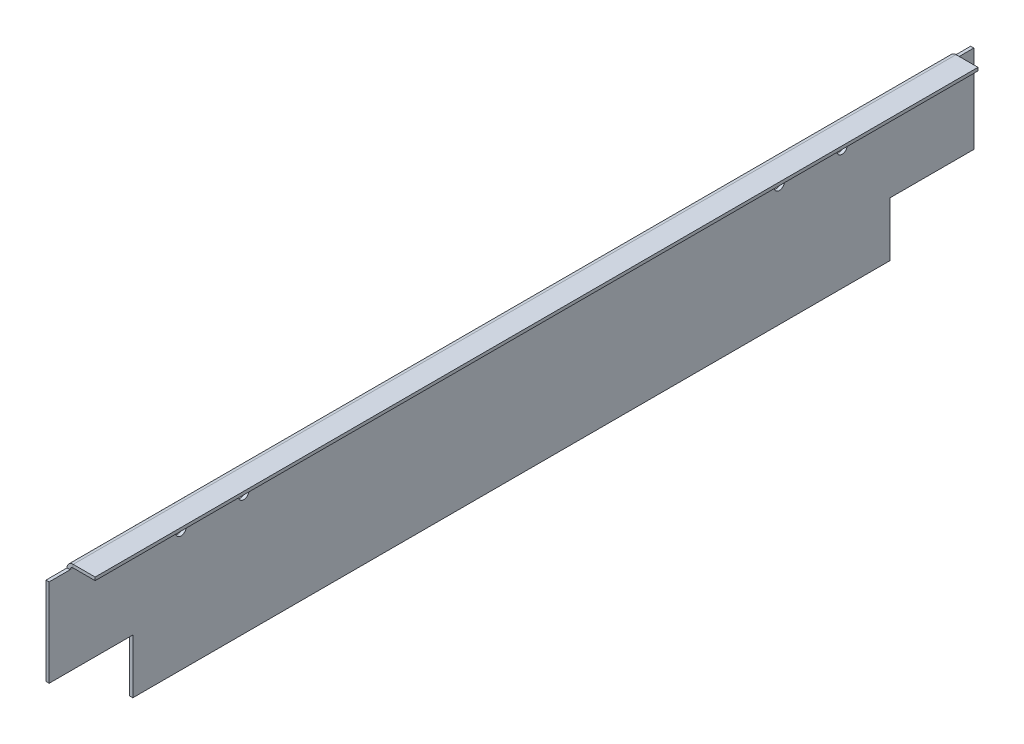
ISO-10303-21;
HEADER;
FILE_DESCRIPTION(('STEP AP214'),'2;1');
FILE_NAME('part.step','',(''),(''),'','','');
FILE_SCHEMA(('AUTOMOTIVE_DESIGN { 1 0 10303 214 1 1 1 1 }'));
ENDSEC;
DATA;
#1=APPLICATION_CONTEXT('core data for automotive mechanical design processes');
#2=APPLICATION_PROTOCOL_DEFINITION('international standard','automotive_design',2000,#1);
#3=PRODUCT_CONTEXT('',#1,'mechanical');
#4=PRODUCT('Part','Part','',(#3));
#5=PRODUCT_RELATED_PRODUCT_CATEGORY('part','',(#4));
#6=PRODUCT_DEFINITION_FORMATION('','',#4);
#7=PRODUCT_DEFINITION_CONTEXT('part definition',#1,'design');
#8=PRODUCT_DEFINITION('design','',#6,#7);
#9=PRODUCT_DEFINITION_SHAPE('','',#8);
#10=(LENGTH_UNIT() NAMED_UNIT(*) SI_UNIT(.MILLI.,.METRE.));
#11=(NAMED_UNIT(*) PLANE_ANGLE_UNIT() SI_UNIT($,.RADIAN.));
#12=(NAMED_UNIT(*) SI_UNIT($,.STERADIAN.) SOLID_ANGLE_UNIT());
#13=UNCERTAINTY_MEASURE_WITH_UNIT(LENGTH_MEASURE(1.E-05),#10,'distance_accuracy_value','');
#14=(GEOMETRIC_REPRESENTATION_CONTEXT(3) GLOBAL_UNCERTAINTY_ASSIGNED_CONTEXT((#13)) GLOBAL_UNIT_ASSIGNED_CONTEXT((#10,
#11,#12)) REPRESENTATION_CONTEXT('',''));
#15=CARTESIAN_POINT('',(0.,0.,0.));
#16=DIRECTION('',(0.,0.,1.));
#17=DIRECTION('',(1.,0.,0.));
#18=AXIS2_PLACEMENT_3D('',#15,#16,#17);
#19=CARTESIAN_POINT('',(-1.5,0.,181.));
#20=DIRECTION('',(0.,1.,0.));
#21=DIRECTION('',(0.,0.,1.));
#22=AXIS2_PLACEMENT_3D('',#19,#20,#21);
#23=PLANE('',#22);
#24=DIRECTION('',(0.,0.,1.));
#25=VECTOR('',#24,1.);
#26=CARTESIAN_POINT('',(0.,0.,181.));
#27=LINE('',#26,#25);
#28=CARTESIAN_POINT('',(0.,0.,211.));
#29=VERTEX_POINT('',#28);
#30=CARTESIAN_POINT('',(0.,0.,221.));
#31=VERTEX_POINT('',#30);
#32=EDGE_CURVE('E310',#29,#31,#27,.T.);
#33=ORIENTED_EDGE('',*,*,#32,.F.);
#34=DIRECTION('',(-1.,0.,0.));
#35=VECTOR('',#34,1.);
#36=CARTESIAN_POINT('',(0.,0.,211.));
#37=LINE('',#36,#35);
#38=CARTESIAN_POINT('',(-1.5,0.,211.));
#39=VERTEX_POINT('',#38);
#40=EDGE_CURVE('E218',#29,#39,#37,.T.);
#41=ORIENTED_EDGE('',*,*,#40,.T.);
#42=DIRECTION('',(0.,0.,1.));
#43=VECTOR('',#42,1.);
#44=CARTESIAN_POINT('',(-1.5,0.,181.));
#45=LINE('',#44,#43);
#46=CARTESIAN_POINT('',(-1.5,0.,221.));
#47=VERTEX_POINT('',#46);
#48=EDGE_CURVE('E299',#39,#47,#45,.T.);
#49=ORIENTED_EDGE('',*,*,#48,.T.);
#50=DIRECTION('',(1.,0.,0.));
#51=VECTOR('',#50,1.);
#52=CARTESIAN_POINT('',(-1.5,0.,221.));
#53=LINE('',#52,#51);
#54=EDGE_CURVE('E253',#47,#31,#53,.T.);
#55=ORIENTED_EDGE('',*,*,#54,.T.);
#56=EDGE_LOOP('',(#33,#41,#49,#55));
#57=FACE_BOUND('',#56,.T.);
#58=ADVANCED_FACE('F65',(#57),#23,.T.);
#59=CARTESIAN_POINT('',(-1.5,0.,-181.));
#60=DIRECTION('',(0.,0.,-1.));
#61=DIRECTION('',(-1.,0.,0.));
#62=AXIS2_PLACEMENT_3D('',#59,#60,#61);
#63=PLANE('',#62);
#64=DIRECTION('',(0.,1.,0.));
#65=VECTOR('',#64,1.);
#66=CARTESIAN_POINT('',(-1.5,0.,-181.));
#67=LINE('',#66,#65);
#68=CARTESIAN_POINT('',(-1.5,-68.,-181.));
#69=VERTEX_POINT('',#68);
#70=CARTESIAN_POINT('',(-1.5,-42.,-181.));
#71=VERTEX_POINT('',#70);
#72=EDGE_CURVE('E296',#69,#71,#67,.T.);
#73=ORIENTED_EDGE('',*,*,#72,.T.);
#74=DIRECTION('',(1.,0.,0.));
#75=VECTOR('',#74,1.);
#76=CARTESIAN_POINT('',(-1.5,-42.,-181.));
#77=LINE('',#76,#75);
#78=CARTESIAN_POINT('',(0.,-42.,-181.));
#79=VERTEX_POINT('',#78);
#80=EDGE_CURVE('E239',#71,#79,#77,.T.);
#81=ORIENTED_EDGE('',*,*,#80,.T.);
#82=DIRECTION('',(0.,1.,0.));
#83=VECTOR('',#82,1.);
#84=CARTESIAN_POINT('',(0.,0.,-181.));
#85=LINE('',#84,#83);
#86=CARTESIAN_POINT('',(0.,-68.,-181.));
#87=VERTEX_POINT('',#86);
#88=EDGE_CURVE('E307',#87,#79,#85,.T.);
#89=ORIENTED_EDGE('',*,*,#88,.F.);
#90=DIRECTION('',(1.,0.,0.));
#91=VECTOR('',#90,1.);
#92=CARTESIAN_POINT('',(-1.5,-68.,-181.));
#93=LINE('',#92,#91);
#94=EDGE_CURVE('E13',#69,#87,#93,.T.);
#95=ORIENTED_EDGE('',*,*,#94,.F.);
#96=EDGE_LOOP('',(#73,#81,#89,#95));
#97=FACE_BOUND('',#96,.T.);
#98=ADVANCED_FACE('F338',(#97),#63,.T.);
#99=CARTESIAN_POINT('',(-1.5,0.,181.));
#100=DIRECTION('',(0.,0.,1.));
#101=DIRECTION('',(1.,0.,0.));
#102=AXIS2_PLACEMENT_3D('',#99,#100,#101);
#103=PLANE('',#102);
#104=DIRECTION('',(1.,0.,0.));
#105=VECTOR('',#104,1.);
#106=CARTESIAN_POINT('',(-1.5,-42.,181.));
#107=LINE('',#106,#105);
#108=CARTESIAN_POINT('',(-1.5,-42.,181.));
#109=VERTEX_POINT('',#108);
#110=CARTESIAN_POINT('',(0.,-42.,181.));
#111=VERTEX_POINT('',#110);
#112=EDGE_CURVE('E258',#109,#111,#107,.T.);
#113=ORIENTED_EDGE('',*,*,#112,.F.);
#114=DIRECTION('',(0.,-1.,0.));
#115=VECTOR('',#114,1.);
#116=CARTESIAN_POINT('',(-1.5,0.,181.));
#117=LINE('',#116,#115);
#118=CARTESIAN_POINT('',(-1.5,-68.,181.));
#119=VERTEX_POINT('',#118);
#120=EDGE_CURVE('E290',#109,#119,#117,.T.);
#121=ORIENTED_EDGE('',*,*,#120,.T.);
#122=DIRECTION('',(1.,0.,0.));
#123=VECTOR('',#122,1.);
#124=CARTESIAN_POINT('',(-1.5,-68.,181.));
#125=LINE('',#124,#123);
#126=CARTESIAN_POINT('',(0.,-68.,181.));
#127=VERTEX_POINT('',#126);
#128=EDGE_CURVE('E69',#119,#127,#125,.T.);
#129=ORIENTED_EDGE('',*,*,#128,.T.);
#130=DIRECTION('',(0.,-1.,0.));
#131=VECTOR('',#130,1.);
#132=CARTESIAN_POINT('',(0.,0.,181.));
#133=LINE('',#132,#131);
#134=EDGE_CURVE('E269',#111,#127,#133,.T.);
#135=ORIENTED_EDGE('',*,*,#134,.F.);
#136=EDGE_LOOP('',(#113,#121,#129,#135));
#137=FACE_BOUND('',#136,.T.);
#138=ADVANCED_FACE('F67',(#137),#103,.T.);
#139=DIRECTION('',(-1.,0.,0.));
#140=VECTOR('',#139,1.);
#141=CARTESIAN_POINT('',(0.,0.,-211.));
#142=LINE('',#141,#140);
#143=CARTESIAN_POINT('',(0.,0.,-211.));
#144=VERTEX_POINT('',#143);
#145=CARTESIAN_POINT('',(-1.49999999999998,0.,-211.));
#146=VERTEX_POINT('',#145);
#147=EDGE_CURVE('E225',#144,#146,#142,.T.);
#148=ORIENTED_EDGE('',*,*,#147,.F.);
#149=CARTESIAN_POINT('',(0.,0.,-221.));
#150=VERTEX_POINT('',#149);
#151=EDGE_CURVE('E293',#150,#144,#27,.T.);
#152=ORIENTED_EDGE('',*,*,#151,.F.);
#153=DIRECTION('',(1.,0.,0.));
#154=VECTOR('',#153,1.);
#155=CARTESIAN_POINT('',(-1.5,0.,-221.));
#156=LINE('',#155,#154);
#157=CARTESIAN_POINT('',(-1.5,0.,-221.));
#158=VERTEX_POINT('',#157);
#159=EDGE_CURVE('E242',#158,#150,#156,.T.);
#160=ORIENTED_EDGE('',*,*,#159,.F.);
#161=EDGE_CURVE('E300',#158,#146,#45,.T.);
#162=ORIENTED_EDGE('',*,*,#161,.T.);
#163=EDGE_LOOP('',(#148,#152,#160,#162));
#164=FACE_BOUND('',#163,.T.);
#165=ADVANCED_FACE('F346',(#164),#23,.T.);
#166=CARTESIAN_POINT('',(-1.5,-68.,181.));
#167=DIRECTION('',(0.,-1.,0.));
#168=DIRECTION('',(0.,0.,-1.));
#169=AXIS2_PLACEMENT_3D('',#166,#167,#168);
#170=PLANE('',#169);
#171=DIRECTION('',(0.,0.,-1.));
#172=VECTOR('',#171,1.);
#173=CARTESIAN_POINT('',(0.,-68.,181.));
#174=LINE('',#173,#172);
#175=EDGE_CURVE('E304',#127,#87,#174,.T.);
#176=ORIENTED_EDGE('',*,*,#175,.F.);
#177=ORIENTED_EDGE('',*,*,#128,.F.);
#178=DIRECTION('',(0.,0.,-1.));
#179=VECTOR('',#178,1.);
#180=CARTESIAN_POINT('',(-1.5,-68.,181.));
#181=LINE('',#180,#179);
#182=EDGE_CURVE('E292',#119,#69,#181,.T.);
#183=ORIENTED_EDGE('',*,*,#182,.T.);
#184=ORIENTED_EDGE('',*,*,#94,.T.);
#185=EDGE_LOOP('',(#176,#177,#183,#184));
#186=FACE_BOUND('',#185,.T.);
#187=ADVANCED_FACE('F334',(#186),#170,.T.);
#188=CARTESIAN_POINT('',(-1.5,0.,0.));
#189=DIRECTION('',(1.,0.,0.));
#190=DIRECTION('',(0.,0.,-1.));
#191=AXIS2_PLACEMENT_3D('',#188,#189,#190);
#192=PLANE('',#191);
#193=CARTESIAN_POINT('',(-1.5,-10.,-158.));
#194=DIRECTION('',(1.,0.,0.));
#195=DIRECTION('',(0.,0.,-1.));
#196=AXIS2_PLACEMENT_3D('',#193,#194,#195);
#197=CIRCLE('',#196,2.5);
#198=CARTESIAN_POINT('',(-1.5,-10.,-160.5));
#199=VERTEX_POINT('',#198);
#200=EDGE_CURVE('E266',#199,#199,#197,.T.);
#201=ORIENTED_EDGE('',*,*,#200,.T.);
#202=EDGE_LOOP('',(#201));
#203=FACE_BOUND('',#202,.T.);
#204=CARTESIAN_POINT('',(-1.5,-10.,-128.));
#205=DIRECTION('',(1.,0.,0.));
#206=DIRECTION('',(0.,0.,-1.));
#207=AXIS2_PLACEMENT_3D('',#204,#205,#206);
#208=CIRCLE('',#207,2.5);
#209=CARTESIAN_POINT('',(-1.5,-10.,-130.5));
#210=VERTEX_POINT('',#209);
#211=EDGE_CURVE('E273',#210,#210,#208,.T.);
#212=ORIENTED_EDGE('',*,*,#211,.T.);
#213=EDGE_LOOP('',(#212));
#214=FACE_BOUND('',#213,.T.);
#215=CARTESIAN_POINT('',(-1.5,-10.,128.));
#216=DIRECTION('',(1.,0.,0.));
#217=DIRECTION('',(0.,0.,1.));
#218=AXIS2_PLACEMENT_3D('',#215,#216,#217);
#219=CIRCLE('',#218,2.5);
#220=CARTESIAN_POINT('',(-1.5,-10.,130.5));
#221=VERTEX_POINT('',#220);
#222=EDGE_CURVE('E279',#221,#221,#219,.T.);
#223=ORIENTED_EDGE('',*,*,#222,.T.);
#224=EDGE_LOOP('',(#223));
#225=FACE_BOUND('',#224,.T.);
#226=CARTESIAN_POINT('',(-1.5,-10.,158.));
#227=DIRECTION('',(1.,0.,0.));
#228=DIRECTION('',(0.,0.,1.));
#229=AXIS2_PLACEMENT_3D('',#226,#227,#228);
#230=CIRCLE('',#229,2.5);
#231=CARTESIAN_POINT('',(-1.5,-10.,160.5));
#232=VERTEX_POINT('',#231);
#233=EDGE_CURVE('E285',#232,#232,#230,.T.);
#234=ORIENTED_EDGE('',*,*,#233,.T.);
#235=EDGE_LOOP('',(#234));
#236=FACE_BOUND('',#235,.T.);
#237=ORIENTED_EDGE('',*,*,#120,.F.);
#238=DIRECTION('',(0.,0.,-1.));
#239=VECTOR('',#238,1.);
#240=CARTESIAN_POINT('',(-1.5,-42.,181.));
#241=LINE('',#240,#239);
#242=CARTESIAN_POINT('',(-1.5,-42.,221.));
#243=VERTEX_POINT('',#242);
#244=EDGE_CURVE('E249',#243,#109,#241,.T.);
#245=ORIENTED_EDGE('',*,*,#244,.F.);
#246=DIRECTION('',(0.,-1.,0.));
#247=VECTOR('',#246,1.);
#248=CARTESIAN_POINT('',(-1.5,-42.,221.));
#249=LINE('',#248,#247);
#250=EDGE_CURVE('E246',#47,#243,#249,.T.);
#251=ORIENTED_EDGE('',*,*,#250,.F.);
#252=ORIENTED_EDGE('',*,*,#48,.F.);
#253=DIRECTION('',(0.,0.,1.));
#254=VECTOR('',#253,1.);
#255=CARTESIAN_POINT('',(-1.50000000000005,0.,211.));
#256=LINE('',#255,#254);
#257=EDGE_CURVE('E169',#39,#146,#256,.F.);
#258=ORIENTED_EDGE('',*,*,#257,.T.);
#259=ORIENTED_EDGE('',*,*,#161,.F.);
#260=DIRECTION('',(0.,1.,0.));
#261=VECTOR('',#260,1.);
#262=CARTESIAN_POINT('',(-1.5,-42.,-221.));
#263=LINE('',#262,#261);
#264=CARTESIAN_POINT('',(-1.5,-42.,-221.));
#265=VERTEX_POINT('',#264);
#266=EDGE_CURVE('E231',#265,#158,#263,.T.);
#267=ORIENTED_EDGE('',*,*,#266,.F.);
#268=DIRECTION('',(0.,0.,-1.));
#269=VECTOR('',#268,1.);
#270=CARTESIAN_POINT('',(-1.5,-42.,-181.));
#271=LINE('',#270,#269);
#272=EDGE_CURVE('E228',#71,#265,#271,.T.);
#273=ORIENTED_EDGE('',*,*,#272,.F.);
#274=ORIENTED_EDGE('',*,*,#72,.F.);
#275=ORIENTED_EDGE('',*,*,#182,.F.);
#276=EDGE_LOOP('',(#237,#245,#251,#252,#258,#259,#267,#273,#274,#275));
#277=FACE_BOUND('',#276,.T.);
#278=ADVANCED_FACE('F351',(#203,#214,#225,#236,#277),#192,.F.);
#279=CARTESIAN_POINT('',(0.,0.,0.));
#280=DIRECTION('',(1.,0.,0.));
#281=DIRECTION('',(0.,0.,-1.));
#282=AXIS2_PLACEMENT_3D('',#279,#280,#281);
#283=PLANE('',#282);
#284=CARTESIAN_POINT('',(0.,-10.,-158.));
#285=DIRECTION('',(1.,0.,0.));
#286=DIRECTION('',(0.,0.,-1.));
#287=AXIS2_PLACEMENT_3D('',#284,#285,#286);
#288=CIRCLE('',#287,2.5);
#289=CARTESIAN_POINT('',(0.,-10.,-160.5));
#290=VERTEX_POINT('',#289);
#291=EDGE_CURVE('E270',#290,#290,#288,.T.);
#292=ORIENTED_EDGE('',*,*,#291,.F.);
#293=EDGE_LOOP('',(#292));
#294=FACE_BOUND('',#293,.T.);
#295=CARTESIAN_POINT('',(0.,-10.,-128.));
#296=DIRECTION('',(1.,0.,0.));
#297=DIRECTION('',(0.,0.,-1.));
#298=AXIS2_PLACEMENT_3D('',#295,#296,#297);
#299=CIRCLE('',#298,2.5);
#300=CARTESIAN_POINT('',(0.,-10.,-130.5));
#301=VERTEX_POINT('',#300);
#302=EDGE_CURVE('E276',#301,#301,#299,.T.);
#303=ORIENTED_EDGE('',*,*,#302,.F.);
#304=EDGE_LOOP('',(#303));
#305=FACE_BOUND('',#304,.T.);
#306=CARTESIAN_POINT('',(0.,-10.,128.));
#307=DIRECTION('',(1.,0.,0.));
#308=DIRECTION('',(0.,0.,1.));
#309=AXIS2_PLACEMENT_3D('',#306,#307,#308);
#310=CIRCLE('',#309,2.5);
#311=CARTESIAN_POINT('',(0.,-10.,130.5));
#312=VERTEX_POINT('',#311);
#313=EDGE_CURVE('E282',#312,#312,#310,.T.);
#314=ORIENTED_EDGE('',*,*,#313,.F.);
#315=EDGE_LOOP('',(#314));
#316=FACE_BOUND('',#315,.T.);
#317=CARTESIAN_POINT('',(0.,-10.,158.));
#318=DIRECTION('',(1.,0.,0.));
#319=DIRECTION('',(0.,0.,1.));
#320=AXIS2_PLACEMENT_3D('',#317,#318,#319);
#321=CIRCLE('',#320,2.5);
#322=CARTESIAN_POINT('',(0.,-10.,160.5));
#323=VERTEX_POINT('',#322);
#324=EDGE_CURVE('E261',#323,#323,#321,.T.);
#325=ORIENTED_EDGE('',*,*,#324,.F.);
#326=EDGE_LOOP('',(#325));
#327=FACE_BOUND('',#326,.T.);
#328=ORIENTED_EDGE('',*,*,#151,.T.);
#329=DIRECTION('',(0.,0.,1.));
#330=VECTOR('',#329,1.);
#331=CARTESIAN_POINT('',(0.,0.,211.));
#332=LINE('',#331,#330);
#333=EDGE_CURVE('E222',#29,#144,#332,.F.);
#334=ORIENTED_EDGE('',*,*,#333,.F.);
#335=ORIENTED_EDGE('',*,*,#32,.T.);
#336=DIRECTION('',(0.,-1.,0.));
#337=VECTOR('',#336,1.);
#338=CARTESIAN_POINT('',(0.,-42.,221.));
#339=LINE('',#338,#337);
#340=CARTESIAN_POINT('',(0.,-42.,221.));
#341=VERTEX_POINT('',#340);
#342=EDGE_CURVE('E241',#31,#341,#339,.T.);
#343=ORIENTED_EDGE('',*,*,#342,.T.);
#344=DIRECTION('',(0.,0.,-1.));
#345=VECTOR('',#344,1.);
#346=CARTESIAN_POINT('',(0.,-42.,181.));
#347=LINE('',#346,#345);
#348=EDGE_CURVE('E250',#341,#111,#347,.T.);
#349=ORIENTED_EDGE('',*,*,#348,.T.);
#350=ORIENTED_EDGE('',*,*,#134,.T.);
#351=ORIENTED_EDGE('',*,*,#175,.T.);
#352=ORIENTED_EDGE('',*,*,#88,.T.);
#353=DIRECTION('',(0.,0.,-1.));
#354=VECTOR('',#353,1.);
#355=CARTESIAN_POINT('',(0.,-42.,-181.));
#356=LINE('',#355,#354);
#357=CARTESIAN_POINT('',(0.,-42.,-221.));
#358=VERTEX_POINT('',#357);
#359=EDGE_CURVE('E88',#79,#358,#356,.T.);
#360=ORIENTED_EDGE('',*,*,#359,.T.);
#361=DIRECTION('',(0.,1.,0.));
#362=VECTOR('',#361,1.);
#363=CARTESIAN_POINT('',(0.,-42.,-221.));
#364=LINE('',#363,#362);
#365=EDGE_CURVE('E232',#358,#150,#364,.T.);
#366=ORIENTED_EDGE('',*,*,#365,.T.);
#367=EDGE_LOOP('',(#328,#334,#335,#343,#349,#350,#351,#352,#360,#366));
#368=FACE_BOUND('',#367,.T.);
#369=ADVANCED_FACE('F315',(#294,#305,#316,#327,#368),#283,.T.);
#370=CARTESIAN_POINT('',(-1.5,-10.,158.));
#371=DIRECTION('',(1.,0.,0.));
#372=DIRECTION('',(0.,0.,-1.));
#373=AXIS2_PLACEMENT_3D('',#370,#371,#372);
#374=CYLINDRICAL_SURFACE('',#373,2.5);
#375=ORIENTED_EDGE('',*,*,#233,.F.);
#376=EDGE_LOOP('',(#375));
#377=FACE_BOUND('',#376,.T.);
#378=ORIENTED_EDGE('',*,*,#324,.T.);
#379=EDGE_LOOP('',(#378));
#380=FACE_BOUND('',#379,.T.);
#381=ADVANCED_FACE('F555',(#377,#380),#374,.F.);
#382=CARTESIAN_POINT('',(-1.5,-10.,128.));
#383=DIRECTION('',(1.,0.,0.));
#384=DIRECTION('',(0.,0.,-1.));
#385=AXIS2_PLACEMENT_3D('',#382,#383,#384);
#386=CYLINDRICAL_SURFACE('',#385,2.5);
#387=ORIENTED_EDGE('',*,*,#222,.F.);
#388=EDGE_LOOP('',(#387));
#389=FACE_BOUND('',#388,.T.);
#390=ORIENTED_EDGE('',*,*,#313,.T.);
#391=EDGE_LOOP('',(#390));
#392=FACE_BOUND('',#391,.T.);
#393=ADVANCED_FACE('F546',(#389,#392),#386,.F.);
#394=CARTESIAN_POINT('',(-1.5,-10.,-128.));
#395=DIRECTION('',(1.,0.,0.));
#396=DIRECTION('',(0.,0.,-1.));
#397=AXIS2_PLACEMENT_3D('',#394,#395,#396);
#398=CYLINDRICAL_SURFACE('',#397,2.5);
#399=ORIENTED_EDGE('',*,*,#211,.F.);
#400=EDGE_LOOP('',(#399));
#401=FACE_BOUND('',#400,.T.);
#402=ORIENTED_EDGE('',*,*,#302,.T.);
#403=EDGE_LOOP('',(#402));
#404=FACE_BOUND('',#403,.T.);
#405=ADVANCED_FACE('F537',(#401,#404),#398,.F.);
#406=CARTESIAN_POINT('',(-1.5,-10.,-158.));
#407=DIRECTION('',(1.,0.,0.));
#408=DIRECTION('',(0.,0.,-1.));
#409=AXIS2_PLACEMENT_3D('',#406,#407,#408);
#410=CYLINDRICAL_SURFACE('',#409,2.5);
#411=ORIENTED_EDGE('',*,*,#200,.F.);
#412=EDGE_LOOP('',(#411));
#413=FACE_BOUND('',#412,.T.);
#414=ORIENTED_EDGE('',*,*,#291,.T.);
#415=EDGE_LOOP('',(#414));
#416=FACE_BOUND('',#415,.T.);
#417=ADVANCED_FACE('F388',(#413,#416),#410,.F.);
#418=CARTESIAN_POINT('',(-1.5,-42.,181.));
#419=DIRECTION('',(0.,-1.,0.));
#420=DIRECTION('',(0.,0.,-1.));
#421=AXIS2_PLACEMENT_3D('',#418,#419,#420);
#422=PLANE('',#421);
#423=ORIENTED_EDGE('',*,*,#348,.F.);
#424=DIRECTION('',(1.,0.,0.));
#425=VECTOR('',#424,1.);
#426=CARTESIAN_POINT('',(-1.5,-42.,221.));
#427=LINE('',#426,#425);
#428=EDGE_CURVE('E262',#243,#341,#427,.T.);
#429=ORIENTED_EDGE('',*,*,#428,.F.);
#430=ORIENTED_EDGE('',*,*,#244,.T.);
#431=ORIENTED_EDGE('',*,*,#112,.T.);
#432=EDGE_LOOP('',(#423,#429,#430,#431));
#433=FACE_BOUND('',#432,.T.);
#434=ADVANCED_FACE('F326',(#433),#422,.T.);
#435=CARTESIAN_POINT('',(-1.5,-42.,221.));
#436=DIRECTION('',(0.,0.,1.));
#437=DIRECTION('',(1.,0.,0.));
#438=AXIS2_PLACEMENT_3D('',#435,#436,#437);
#439=PLANE('',#438);
#440=ORIENTED_EDGE('',*,*,#342,.F.);
#441=ORIENTED_EDGE('',*,*,#54,.F.);
#442=ORIENTED_EDGE('',*,*,#250,.T.);
#443=ORIENTED_EDGE('',*,*,#428,.T.);
#444=EDGE_LOOP('',(#440,#441,#442,#443));
#445=FACE_BOUND('',#444,.T.);
#446=ADVANCED_FACE('F323',(#445),#439,.T.);
#447=CARTESIAN_POINT('',(-1.5,-42.,-181.));
#448=DIRECTION('',(0.,-1.,0.));
#449=DIRECTION('',(0.,0.,-1.));
#450=AXIS2_PLACEMENT_3D('',#447,#448,#449);
#451=PLANE('',#450);
#452=ORIENTED_EDGE('',*,*,#359,.F.);
#453=ORIENTED_EDGE('',*,*,#80,.F.);
#454=ORIENTED_EDGE('',*,*,#272,.T.);
#455=DIRECTION('',(1.,0.,0.));
#456=VECTOR('',#455,1.);
#457=CARTESIAN_POINT('',(-1.5,-42.,-221.));
#458=LINE('',#457,#456);
#459=EDGE_CURVE('E235',#265,#358,#458,.T.);
#460=ORIENTED_EDGE('',*,*,#459,.T.);
#461=EDGE_LOOP('',(#452,#453,#454,#460));
#462=FACE_BOUND('',#461,.T.);
#463=ADVANCED_FACE('F353',(#462),#451,.T.);
#464=CARTESIAN_POINT('',(-1.5,-42.,-221.));
#465=DIRECTION('',(0.,0.,-1.));
#466=DIRECTION('',(-1.,0.,0.));
#467=AXIS2_PLACEMENT_3D('',#464,#465,#466);
#468=PLANE('',#467);
#469=ORIENTED_EDGE('',*,*,#365,.F.);
#470=ORIENTED_EDGE('',*,*,#459,.F.);
#471=ORIENTED_EDGE('',*,*,#266,.T.);
#472=ORIENTED_EDGE('',*,*,#159,.T.);
#473=EDGE_LOOP('',(#469,#470,#471,#472));
#474=FACE_BOUND('',#473,.T.);
#475=ADVANCED_FACE('F341',(#474),#468,.T.);
#476=CARTESIAN_POINT('',(1.50000000000003,0.,-211.));
#477=DIRECTION('',(0.,0.,-1.));
#478=DIRECTION('',(-1.,0.,0.));
#479=AXIS2_PLACEMENT_3D('',#476,#477,#478);
#480=PLANE('',#479);
#481=DIRECTION('',(0.,1.,0.));
#482=VECTOR('',#481,1.);
#483=CARTESIAN_POINT('',(1.50000000000003,3.,-211.));
#484=LINE('',#483,#482);
#485=CARTESIAN_POINT('',(1.50000000000002,1.5,-211.));
#486=VERTEX_POINT('',#485);
#487=CARTESIAN_POINT('',(1.50000000000002,3.,-211.));
#488=VERTEX_POINT('',#487);
#489=EDGE_CURVE('E213',#486,#488,#484,.T.);
#490=ORIENTED_EDGE('',*,*,#489,.F.);
#491=CARTESIAN_POINT('',(1.50000000000003,0.,-211.));
#492=DIRECTION('',(0.,0.,1.));
#493=DIRECTION('',(1.,0.,0.));
#494=AXIS2_PLACEMENT_3D('',#491,#492,#493);
#495=CIRCLE('',#494,1.50000000000002);
#496=EDGE_CURVE('E171',#144,#486,#495,.F.);
#497=ORIENTED_EDGE('',*,*,#496,.F.);
#498=ORIENTED_EDGE('',*,*,#147,.T.);
#499=CARTESIAN_POINT('',(1.50000000000003,0.,-211.));
#500=DIRECTION('',(0.,0.,1.));
#501=DIRECTION('',(1.,0.,0.));
#502=AXIS2_PLACEMENT_3D('',#499,#500,#501);
#503=CIRCLE('',#502,3.00000000000001);
#504=EDGE_CURVE('E217',#146,#488,#503,.F.);
#505=ORIENTED_EDGE('',*,*,#504,.T.);
#506=EDGE_LOOP('',(#490,#497,#498,#505));
#507=FACE_BOUND('',#506,.T.);
#508=ADVANCED_FACE('F349',(#507),#480,.T.);
#509=CARTESIAN_POINT('',(1.49999999999997,0.,211.));
#510=DIRECTION('',(0.,0.,-1.));
#511=DIRECTION('',(-1.,0.,0.));
#512=AXIS2_PLACEMENT_3D('',#509,#510,#511);
#513=PLANE('',#512);
#514=CARTESIAN_POINT('',(1.49999999999997,0.,211.));
#515=DIRECTION('',(0.,0.,1.));
#516=DIRECTION('',(1.,0.,0.));
#517=AXIS2_PLACEMENT_3D('',#514,#515,#516);
#518=CIRCLE('',#517,1.50000000000002);
#519=CARTESIAN_POINT('',(1.49999999999996,1.50000000000003,211.));
#520=VERTEX_POINT('',#519);
#521=EDGE_CURVE('E178',#520,#29,#518,.T.);
#522=ORIENTED_EDGE('',*,*,#521,.F.);
#523=DIRECTION('',(0.,1.,0.));
#524=VECTOR('',#523,1.);
#525=CARTESIAN_POINT('',(1.49999999999996,1.49999999999996,211.));
#526=LINE('',#525,#524);
#527=CARTESIAN_POINT('',(1.49999999999995,3.,211.));
#528=VERTEX_POINT('',#527);
#529=EDGE_CURVE('E175',#520,#528,#526,.T.);
#530=ORIENTED_EDGE('',*,*,#529,.T.);
#531=CARTESIAN_POINT('',(1.49999999999997,0.,211.));
#532=DIRECTION('',(0.,0.,1.));
#533=DIRECTION('',(1.,0.,0.));
#534=AXIS2_PLACEMENT_3D('',#531,#532,#533);
#535=CIRCLE('',#534,3.00000000000001);
#536=EDGE_CURVE('E80',#528,#39,#535,.T.);
#537=ORIENTED_EDGE('',*,*,#536,.T.);
#538=ORIENTED_EDGE('',*,*,#40,.F.);
#539=EDGE_LOOP('',(#522,#530,#537,#538));
#540=FACE_BOUND('',#539,.T.);
#541=ADVANCED_FACE('F176',(#540),#513,.F.);
#542=CARTESIAN_POINT('',(1.49999999999997,0.,211.));
#543=DIRECTION('',(0.,0.,1.));
#544=DIRECTION('',(0.,1.,0.));
#545=AXIS2_PLACEMENT_3D('',#542,#543,#544);
#546=CYLINDRICAL_SURFACE('',#545,3.00000000000001);
#547=ORIENTED_EDGE('',*,*,#257,.F.);
#548=ORIENTED_EDGE('',*,*,#536,.F.);
#549=DIRECTION('',(0.,0.,1.));
#550=VECTOR('',#549,1.);
#551=CARTESIAN_POINT('',(1.49999999999999,3.,0.));
#552=LINE('',#551,#550);
#553=EDGE_CURVE('E166',#488,#528,#552,.T.);
#554=ORIENTED_EDGE('',*,*,#553,.F.);
#555=ORIENTED_EDGE('',*,*,#504,.F.);
#556=EDGE_LOOP('',(#547,#548,#554,#555));
#557=FACE_BOUND('',#556,.T.);
#558=ADVANCED_FACE('F163',(#557),#546,.T.);
#559=CARTESIAN_POINT('',(1.49999999999997,0.,211.));
#560=DIRECTION('',(0.,0.,1.));
#561=DIRECTION('',(0.,1.,0.));
#562=AXIS2_PLACEMENT_3D('',#559,#560,#561);
#563=CYLINDRICAL_SURFACE('',#562,1.50000000000002);
#564=ORIENTED_EDGE('',*,*,#333,.T.);
#565=ORIENTED_EDGE('',*,*,#496,.T.);
#566=DIRECTION('',(0.,0.,-1.));
#567=VECTOR('',#566,1.);
#568=CARTESIAN_POINT('',(1.50000000000003,1.5,-211.));
#569=LINE('',#568,#567);
#570=EDGE_CURVE('E183',#486,#520,#569,.F.);
#571=ORIENTED_EDGE('',*,*,#570,.T.);
#572=ORIENTED_EDGE('',*,*,#521,.T.);
#573=EDGE_LOOP('',(#564,#565,#571,#572));
#574=FACE_BOUND('',#573,.T.);
#575=ADVANCED_FACE('F448',(#574),#563,.F.);
#576=CARTESIAN_POINT('',(0.,2.99999999999999,211.));
#577=DIRECTION('',(0.,0.,1.));
#578=DIRECTION('',(1.,0.,0.));
#579=AXIS2_PLACEMENT_3D('',#576,#577,#578);
#580=PLANE('',#579);
#581=DIRECTION('',(-1.,0.,0.));
#582=VECTOR('',#581,1.);
#583=CARTESIAN_POINT('',(0.,2.99999999999999,211.));
#584=LINE('',#583,#582);
#585=CARTESIAN_POINT('',(12.,3.00000000000004,211.));
#586=VERTEX_POINT('',#585);
#587=EDGE_CURVE('E190',#586,#528,#584,.T.);
#588=ORIENTED_EDGE('',*,*,#587,.T.);
#589=ORIENTED_EDGE('',*,*,#529,.F.);
#590=DIRECTION('',(1.,0.,0.));
#591=VECTOR('',#590,1.);
#592=CARTESIAN_POINT('',(0.,1.49999999999999,211.));
#593=LINE('',#592,#591);
#594=CARTESIAN_POINT('',(12.,1.50000000000004,211.));
#595=VERTEX_POINT('',#594);
#596=EDGE_CURVE('E206',#595,#520,#593,.F.);
#597=ORIENTED_EDGE('',*,*,#596,.F.);
#598=DIRECTION('',(0.,-1.,0.));
#599=VECTOR('',#598,1.);
#600=CARTESIAN_POINT('',(12.,3.00000000000004,211.));
#601=LINE('',#600,#599);
#602=EDGE_CURVE('E195',#586,#595,#601,.T.);
#603=ORIENTED_EDGE('',*,*,#602,.F.);
#604=EDGE_LOOP('',(#588,#589,#597,#603));
#605=FACE_BOUND('',#604,.T.);
#606=ADVANCED_FACE('F194',(#605),#580,.T.);
#607=CARTESIAN_POINT('',(12.,3.00000000000004,-211.));
#608=DIRECTION('',(0.,0.,-1.));
#609=DIRECTION('',(-1.,0.,0.));
#610=AXIS2_PLACEMENT_3D('',#607,#608,#609);
#611=PLANE('',#610);
#612=DIRECTION('',(-1.,0.,0.));
#613=VECTOR('',#612,1.);
#614=CARTESIAN_POINT('',(0.,1.49999999999999,-211.));
#615=LINE('',#614,#613);
#616=CARTESIAN_POINT('',(12.,1.50000000000004,-211.));
#617=VERTEX_POINT('',#616);
#618=EDGE_CURVE('E192',#486,#617,#615,.F.);
#619=ORIENTED_EDGE('',*,*,#618,.F.);
#620=ORIENTED_EDGE('',*,*,#489,.T.);
#621=DIRECTION('',(1.,0.,0.));
#622=VECTOR('',#621,1.);
#623=CARTESIAN_POINT('',(12.,3.00000000000004,-211.));
#624=LINE('',#623,#622);
#625=CARTESIAN_POINT('',(12.,3.00000000000004,-211.));
#626=VERTEX_POINT('',#625);
#627=EDGE_CURVE('E191',#488,#626,#624,.T.);
#628=ORIENTED_EDGE('',*,*,#627,.T.);
#629=DIRECTION('',(0.,-1.,0.));
#630=VECTOR('',#629,1.);
#631=CARTESIAN_POINT('',(12.,3.00000000000004,-211.));
#632=LINE('',#631,#630);
#633=EDGE_CURVE('E197',#626,#617,#632,.T.);
#634=ORIENTED_EDGE('',*,*,#633,.T.);
#635=EDGE_LOOP('',(#619,#620,#628,#634));
#636=FACE_BOUND('',#635,.T.);
#637=ADVANCED_FACE('F468',(#636),#611,.T.);
#638=CARTESIAN_POINT('',(0.,2.99999999999999,0.));
#639=DIRECTION('',(0.,1.,0.));
#640=DIRECTION('',(-1.,0.,0.));
#641=AXIS2_PLACEMENT_3D('',#638,#639,#640);
#642=PLANE('',#641);
#643=ORIENTED_EDGE('',*,*,#627,.F.);
#644=ORIENTED_EDGE('',*,*,#553,.T.);
#645=ORIENTED_EDGE('',*,*,#587,.F.);
#646=DIRECTION('',(0.,0.,1.));
#647=VECTOR('',#646,1.);
#648=CARTESIAN_POINT('',(12.,3.00000000000004,211.));
#649=LINE('',#648,#647);
#650=EDGE_CURVE('E198',#626,#586,#649,.T.);
#651=ORIENTED_EDGE('',*,*,#650,.F.);
#652=EDGE_LOOP('',(#643,#644,#645,#651));
#653=FACE_BOUND('',#652,.T.);
#654=ADVANCED_FACE('F188',(#653),#642,.T.);
#655=CARTESIAN_POINT('',(0.,1.49999999999999,0.));
#656=DIRECTION('',(0.,1.,0.));
#657=DIRECTION('',(-1.,0.,0.));
#658=AXIS2_PLACEMENT_3D('',#655,#656,#657);
#659=PLANE('',#658);
#660=ORIENTED_EDGE('',*,*,#570,.F.);
#661=ORIENTED_EDGE('',*,*,#618,.T.);
#662=DIRECTION('',(0.,0.,-1.));
#663=VECTOR('',#662,1.);
#664=CARTESIAN_POINT('',(12.,1.50000000000004,0.));
#665=LINE('',#664,#663);
#666=EDGE_CURVE('E208',#617,#595,#665,.F.);
#667=ORIENTED_EDGE('',*,*,#666,.T.);
#668=ORIENTED_EDGE('',*,*,#596,.T.);
#669=EDGE_LOOP('',(#660,#661,#667,#668));
#670=FACE_BOUND('',#669,.T.);
#671=ADVANCED_FACE('F488',(#670),#659,.F.);
#672=CARTESIAN_POINT('',(12.,3.00000000000004,211.));
#673=DIRECTION('',(1.,0.,0.));
#674=DIRECTION('',(0.,1.,0.));
#675=AXIS2_PLACEMENT_3D('',#672,#673,#674);
#676=PLANE('',#675);
#677=ORIENTED_EDGE('',*,*,#666,.F.);
#678=ORIENTED_EDGE('',*,*,#633,.F.);
#679=ORIENTED_EDGE('',*,*,#650,.T.);
#680=ORIENTED_EDGE('',*,*,#602,.T.);
#681=EDGE_LOOP('',(#677,#678,#679,#680));
#682=FACE_BOUND('',#681,.T.);
#683=ADVANCED_FACE('F498',(#682),#676,.T.);
#684=CLOSED_SHELL('',(#58,#98,#138,#165,#187,#278,#369,#381,#393,#405,#417,#434,#446,#463,#475,
#508,#541,#558,#575,#606,#637,#654,#671,#683));
#685=MANIFOLD_SOLID_BREP('B2',#684);
#686=ADVANCED_BREP_SHAPE_REPRESENTATION('',(#18,#685),#14);
#687=SHAPE_DEFINITION_REPRESENTATION(#9,#686);
ENDSEC;
END-ISO-10303-21;
